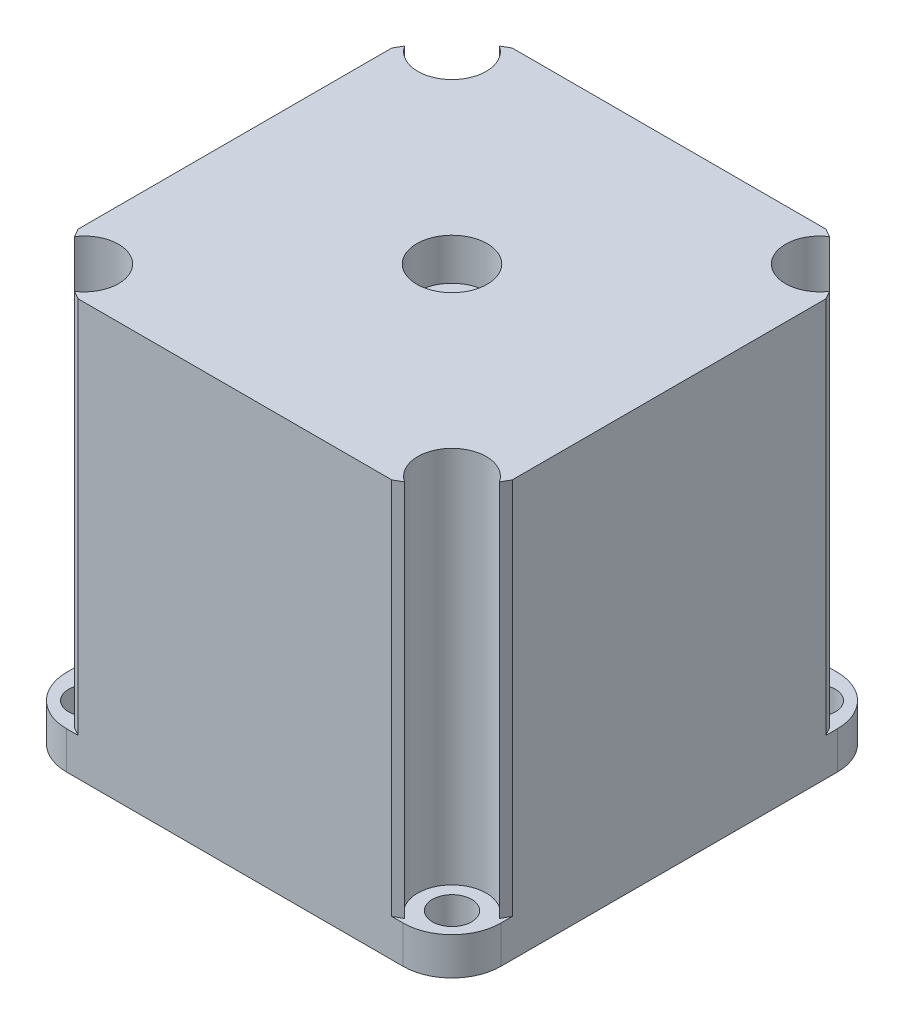
ISO-10303-21;
HEADER;
FILE_DESCRIPTION(('STEP AP214'),'2;1');
FILE_NAME('part.step','',(''),(''),'','','');
FILE_SCHEMA(('AUTOMOTIVE_DESIGN { 1 0 10303 214 1 1 1 1 }'));
ENDSEC;
DATA;
#1=APPLICATION_CONTEXT('core data for automotive mechanical design processes');
#2=APPLICATION_PROTOCOL_DEFINITION('international standard','automotive_design',2000,#1);
#3=PRODUCT_CONTEXT('',#1,'mechanical');
#4=PRODUCT('Part','Part','',(#3));
#5=PRODUCT_RELATED_PRODUCT_CATEGORY('part','',(#4));
#6=PRODUCT_DEFINITION_FORMATION('','',#4);
#7=PRODUCT_DEFINITION_CONTEXT('part definition',#1,'design');
#8=PRODUCT_DEFINITION('design','',#6,#7);
#9=PRODUCT_DEFINITION_SHAPE('','',#8);
#10=(LENGTH_UNIT() NAMED_UNIT(*) SI_UNIT(.MILLI.,.METRE.));
#11=(NAMED_UNIT(*) PLANE_ANGLE_UNIT() SI_UNIT($,.RADIAN.));
#12=(NAMED_UNIT(*) SI_UNIT($,.STERADIAN.) SOLID_ANGLE_UNIT());
#13=UNCERTAINTY_MEASURE_WITH_UNIT(LENGTH_MEASURE(1.E-05),#10,'distance_accuracy_value','');
#14=(GEOMETRIC_REPRESENTATION_CONTEXT(3) GLOBAL_UNCERTAINTY_ASSIGNED_CONTEXT((#13)) GLOBAL_UNIT_ASSIGNED_CONTEXT((#10,
#11,#12)) REPRESENTATION_CONTEXT('',''));
#15=CARTESIAN_POINT('',(0.,0.,0.));
#16=DIRECTION('',(0.,0.,1.));
#17=DIRECTION('',(1.,0.,0.));
#18=AXIS2_PLACEMENT_3D('',#15,#16,#17);
#19=CARTESIAN_POINT('',(0.,-1.8542,0.));
#20=DIRECTION('',(0.,-1.,0.));
#21=DIRECTION('',(0.,0.,-1.));
#22=AXIS2_PLACEMENT_3D('',#19,#20,#21);
#23=PLANE('',#22);
#24=CARTESIAN_POINT('',(0.,-1.8542,0.));
#25=DIRECTION('',(0.,-1.,0.));
#26=DIRECTION('',(0.,0.,-1.));
#27=AXIS2_PLACEMENT_3D('',#24,#25,#26);
#28=CIRCLE('',#27,19.05);
#29=CARTESIAN_POINT('',(0.,-1.8542,-19.05));
#30=VERTEX_POINT('',#29);
#31=EDGE_CURVE('E750',#30,#30,#28,.T.);
#32=ORIENTED_EDGE('',*,*,#31,.T.);
#33=EDGE_LOOP('',(#32));
#34=FACE_BOUND('',#33,.T.);
#35=CARTESIAN_POINT('',(0.,-1.8542,0.));
#36=DIRECTION('',(0.,-1.,0.));
#37=DIRECTION('',(0.,0.,-1.));
#38=AXIS2_PLACEMENT_3D('',#35,#36,#37);
#39=CIRCLE('',#38,3.175);
#40=CARTESIAN_POINT('',(0.,-1.8542,-3.175));
#41=VERTEX_POINT('',#40);
#42=EDGE_CURVE('E747',#41,#41,#39,.T.);
#43=ORIENTED_EDGE('',*,*,#42,.F.);
#44=EDGE_LOOP('',(#43));
#45=FACE_BOUND('',#44,.T.);
#46=ADVANCED_FACE('F50',(#34,#45),#23,.T.);
#47=CARTESIAN_POINT('',(0.,0.,0.));
#48=DIRECTION('',(0.,-1.,0.));
#49=DIRECTION('',(0.,0.,-1.));
#50=AXIS2_PLACEMENT_3D('',#47,#48,#49);
#51=PLANE('',#50);
#52=CARTESIAN_POINT('',(-23.622,0.,-23.622));
#53=DIRECTION('',(0.,-1.,0.));
#54=DIRECTION('',(0.,0.,-1.));
#55=AXIS2_PLACEMENT_3D('',#52,#53,#54);
#56=CIRCLE('',#55,2.54);
#57=CARTESIAN_POINT('',(-23.622,0.,-26.162));
#58=VERTEX_POINT('',#57);
#59=EDGE_CURVE('E760',#58,#58,#56,.F.);
#60=ORIENTED_EDGE('',*,*,#59,.T.);
#61=EDGE_LOOP('',(#60));
#62=FACE_BOUND('',#61,.T.);
#63=CARTESIAN_POINT('',(23.622,0.,-23.622));
#64=DIRECTION('',(0.,-1.,0.));
#65=DIRECTION('',(0.,0.,-1.));
#66=AXIS2_PLACEMENT_3D('',#63,#64,#65);
#67=CIRCLE('',#66,2.54);
#68=CARTESIAN_POINT('',(23.622,0.,-26.162));
#69=VERTEX_POINT('',#68);
#70=EDGE_CURVE('E769',#69,#69,#67,.T.);
#71=ORIENTED_EDGE('',*,*,#70,.F.);
#72=EDGE_LOOP('',(#71));
#73=FACE_BOUND('',#72,.T.);
#74=DIRECTION('',(-1.,0.,0.));
#75=VECTOR('',#74,1.);
#76=CARTESIAN_POINT('',(28.194,0.,-28.194));
#77=LINE('',#76,#75);
#78=CARTESIAN_POINT('',(21.844,0.,-28.194));
#79=VERTEX_POINT('',#78);
#80=CARTESIAN_POINT('',(-21.844,0.,-28.194));
#81=VERTEX_POINT('',#80);
#82=EDGE_CURVE('E218',#79,#81,#77,.T.);
#83=ORIENTED_EDGE('',*,*,#82,.F.);
#84=CARTESIAN_POINT('',(21.844,0.,-21.844));
#85=DIRECTION('',(0.,-1.,0.));
#86=DIRECTION('',(0.,0.,-1.));
#87=AXIS2_PLACEMENT_3D('',#84,#85,#86);
#88=CIRCLE('',#87,6.35);
#89=CARTESIAN_POINT('',(28.194,0.,-21.844));
#90=VERTEX_POINT('',#89);
#91=EDGE_CURVE('E227',#79,#90,#88,.T.);
#92=ORIENTED_EDGE('',*,*,#91,.T.);
#93=DIRECTION('',(0.,0.,-1.));
#94=VECTOR('',#93,1.);
#95=CARTESIAN_POINT('',(28.194,0.,-28.194));
#96=LINE('',#95,#94);
#97=CARTESIAN_POINT('',(28.194,0.,21.844));
#98=VERTEX_POINT('',#97);
#99=EDGE_CURVE('E242',#98,#90,#96,.T.);
#100=ORIENTED_EDGE('',*,*,#99,.F.);
#101=CARTESIAN_POINT('',(21.844,0.,21.844));
#102=DIRECTION('',(0.,-1.,0.));
#103=DIRECTION('',(0.,0.,-1.));
#104=AXIS2_PLACEMENT_3D('',#101,#102,#103);
#105=CIRCLE('',#104,6.35);
#106=CARTESIAN_POINT('',(21.844,0.,28.194));
#107=VERTEX_POINT('',#106);
#108=EDGE_CURVE('E254',#98,#107,#105,.T.);
#109=ORIENTED_EDGE('',*,*,#108,.T.);
#110=DIRECTION('',(1.,0.,0.));
#111=VECTOR('',#110,1.);
#112=CARTESIAN_POINT('',(28.194,0.,28.194));
#113=LINE('',#112,#111);
#114=CARTESIAN_POINT('',(-21.844,0.,28.194));
#115=VERTEX_POINT('',#114);
#116=EDGE_CURVE('E247',#115,#107,#113,.T.);
#117=ORIENTED_EDGE('',*,*,#116,.F.);
#118=CARTESIAN_POINT('',(-21.844,0.,21.844));
#119=DIRECTION('',(0.,-1.,0.));
#120=DIRECTION('',(0.,0.,-1.));
#121=AXIS2_PLACEMENT_3D('',#118,#119,#120);
#122=CIRCLE('',#121,6.35);
#123=CARTESIAN_POINT('',(-28.194,0.,21.844));
#124=VERTEX_POINT('',#123);
#125=EDGE_CURVE('E223',#115,#124,#122,.T.);
#126=ORIENTED_EDGE('',*,*,#125,.T.);
#127=DIRECTION('',(0.,0.,1.));
#128=VECTOR('',#127,1.);
#129=CARTESIAN_POINT('',(-28.194,0.,-28.194));
#130=LINE('',#129,#128);
#131=CARTESIAN_POINT('',(-28.194,0.,-21.844));
#132=VERTEX_POINT('',#131);
#133=EDGE_CURVE('E402',#132,#124,#130,.T.);
#134=ORIENTED_EDGE('',*,*,#133,.F.);
#135=CARTESIAN_POINT('',(-21.844,0.,-21.844));
#136=DIRECTION('',(0.,-1.,0.));
#137=DIRECTION('',(0.,0.,-1.));
#138=AXIS2_PLACEMENT_3D('',#135,#136,#137);
#139=CIRCLE('',#138,6.35);
#140=EDGE_CURVE('E235',#132,#81,#139,.T.);
#141=ORIENTED_EDGE('',*,*,#140,.T.);
#142=EDGE_LOOP('',(#83,#92,#100,#109,#117,#126,#134,#141));
#143=FACE_BOUND('',#142,.T.);
#144=CARTESIAN_POINT('',(-23.622,0.,23.622));
#145=DIRECTION('',(0.,-1.,0.));
#146=DIRECTION('',(0.,0.,-1.));
#147=AXIS2_PLACEMENT_3D('',#144,#145,#146);
#148=CIRCLE('',#147,2.54);
#149=CARTESIAN_POINT('',(-23.622,0.,21.082));
#150=VERTEX_POINT('',#149);
#151=EDGE_CURVE('E382',#150,#150,#148,.T.);
#152=ORIENTED_EDGE('',*,*,#151,.F.);
#153=EDGE_LOOP('',(#152));
#154=FACE_BOUND('',#153,.T.);
#155=CARTESIAN_POINT('',(23.622,0.,23.622));
#156=DIRECTION('',(0.,-1.,0.));
#157=DIRECTION('',(0.,0.,-1.));
#158=AXIS2_PLACEMENT_3D('',#155,#156,#157);
#159=CIRCLE('',#158,2.54);
#160=CARTESIAN_POINT('',(23.622,0.,21.082));
#161=VERTEX_POINT('',#160);
#162=EDGE_CURVE('E772',#161,#161,#159,.F.);
#163=ORIENTED_EDGE('',*,*,#162,.T.);
#164=EDGE_LOOP('',(#163));
#165=FACE_BOUND('',#164,.T.);
#166=CARTESIAN_POINT('',(0.,0.,0.));
#167=DIRECTION('',(0.,-1.,0.));
#168=DIRECTION('',(0.,0.,-1.));
#169=AXIS2_PLACEMENT_3D('',#166,#167,#168);
#170=CIRCLE('',#169,19.05);
#171=CARTESIAN_POINT('',(0.,0.,-19.05));
#172=VERTEX_POINT('',#171);
#173=EDGE_CURVE('E746',#172,#172,#170,.T.);
#174=ORIENTED_EDGE('',*,*,#173,.F.);
#175=EDGE_LOOP('',(#174));
#176=FACE_BOUND('',#175,.T.);
#177=ADVANCED_FACE('F237',(#62,#73,#143,#154,#165,#176),#51,.T.);
#178=CARTESIAN_POINT('',(0.,4.87679999999999,0.));
#179=DIRECTION('',(0.,1.,0.));
#180=DIRECTION('',(0.,0.,1.));
#181=AXIS2_PLACEMENT_3D('',#178,#179,#180);
#182=PLANE('',#181);
#183=CARTESIAN_POINT('',(-21.844,4.87679999999999,-21.844));
#184=DIRECTION('',(0.,1.,0.));
#185=DIRECTION('',(0.,0.,1.));
#186=AXIS2_PLACEMENT_3D('',#183,#184,#185);
#187=CIRCLE('',#186,6.35);
#188=CARTESIAN_POINT('',(-21.844,4.87679999999999,-28.194));
#189=VERTEX_POINT('',#188);
#190=CARTESIAN_POINT('',(-28.194,4.87679999999999,-21.844));
#191=VERTEX_POINT('',#190);
#192=EDGE_CURVE('E266',#189,#191,#187,.T.);
#193=ORIENTED_EDGE('',*,*,#192,.T.);
#194=DIRECTION('',(0.,0.,-1.));
#195=VECTOR('',#194,1.);
#196=CARTESIAN_POINT('',(-28.194,4.87679999999999,0.));
#197=LINE('',#196,#195);
#198=CARTESIAN_POINT('',(-28.194,4.87679999999999,-20.3677680016085));
#199=VERTEX_POINT('',#198);
#200=EDGE_CURVE('E302',#199,#191,#197,.T.);
#201=ORIENTED_EDGE('',*,*,#200,.F.);
#202=DIRECTION('',(-0.495314723269123,0.,0.868713603503958));
#203=VECTOR('',#202,1.);
#204=CARTESIAN_POINT('',(-27.5879462794571,4.87679999999999,-21.430702509218));
#205=LINE('',#204,#203);
#206=CARTESIAN_POINT('',(-27.5879462794571,4.87679999999999,-21.430702509218));
#207=VERTEX_POINT('',#206);
#208=EDGE_CURVE('E356',#199,#207,#205,.F.);
#209=ORIENTED_EDGE('',*,*,#208,.T.);
#210=CARTESIAN_POINT('',(-23.876,4.87679999999999,-23.876));
#211=DIRECTION('',(0.,1.,0.));
#212=DIRECTION('',(0.,0.,1.));
#213=AXIS2_PLACEMENT_3D('',#210,#211,#212);
#214=CIRCLE('',#213,4.445);
#215=CARTESIAN_POINT('',(-21.430702509218,4.87679999999999,-27.5879462794571));
#216=VERTEX_POINT('',#215);
#217=EDGE_CURVE('E404',#207,#216,#214,.T.);
#218=ORIENTED_EDGE('',*,*,#217,.T.);
#219=DIRECTION('',(0.868713603503955,0.,-0.495314723269128));
#220=VECTOR('',#219,1.);
#221=CARTESIAN_POINT('',(-21.430702509218,4.87679999999999,-27.5879462794571));
#222=LINE('',#221,#220);
#223=CARTESIAN_POINT('',(-20.3677680016085,4.87679999999999,-28.194));
#224=VERTEX_POINT('',#223);
#225=EDGE_CURVE('E358',#216,#224,#222,.T.);
#226=ORIENTED_EDGE('',*,*,#225,.T.);
#227=DIRECTION('',(1.,0.,0.));
#228=VECTOR('',#227,1.);
#229=CARTESIAN_POINT('',(0.,4.87679999999999,-28.194));
#230=LINE('',#229,#228);
#231=EDGE_CURVE('E313',#189,#224,#230,.T.);
#232=ORIENTED_EDGE('',*,*,#231,.F.);
#233=EDGE_LOOP('',(#193,#201,#209,#218,#226,#232));
#234=FACE_BOUND('',#233,.T.);
#235=CARTESIAN_POINT('',(-23.622,4.87679999999999,-23.622));
#236=DIRECTION('',(0.,1.,0.));
#237=DIRECTION('',(0.,0.,1.));
#238=AXIS2_PLACEMENT_3D('',#235,#236,#237);
#239=CIRCLE('',#238,2.54);
#240=CARTESIAN_POINT('',(-23.622,4.87679999999999,-21.082));
#241=VERTEX_POINT('',#240);
#242=EDGE_CURVE('E765',#241,#241,#239,.T.);
#243=ORIENTED_EDGE('',*,*,#242,.F.);
#244=EDGE_LOOP('',(#243));
#245=FACE_BOUND('',#244,.T.);
#246=ADVANCED_FACE('F454',(#234,#245),#182,.T.);
#247=CARTESIAN_POINT('',(0.,4.87679999999999,0.));
#248=DIRECTION('',(0.,1.,0.));
#249=DIRECTION('',(0.,0.,1.));
#250=AXIS2_PLACEMENT_3D('',#247,#248,#249);
#251=PLANE('',#250);
#252=CARTESIAN_POINT('',(21.844,4.87679999999999,21.844));
#253=DIRECTION('',(0.,1.,0.));
#254=DIRECTION('',(0.,0.,1.));
#255=AXIS2_PLACEMENT_3D('',#252,#253,#254);
#256=CIRCLE('',#255,6.35);
#257=CARTESIAN_POINT('',(21.844,4.87679999999999,28.194));
#258=VERTEX_POINT('',#257);
#259=CARTESIAN_POINT('',(28.194,4.87679999999999,21.844));
#260=VERTEX_POINT('',#259);
#261=EDGE_CURVE('E73',#258,#260,#256,.T.);
#262=ORIENTED_EDGE('',*,*,#261,.T.);
#263=DIRECTION('',(0.,0.,1.));
#264=VECTOR('',#263,1.);
#265=CARTESIAN_POINT('',(28.194,4.87679999999999,0.));
#266=LINE('',#265,#264);
#267=CARTESIAN_POINT('',(28.194,4.87679999999999,20.3677680016085));
#268=VERTEX_POINT('',#267);
#269=EDGE_CURVE('E322',#268,#260,#266,.T.);
#270=ORIENTED_EDGE('',*,*,#269,.F.);
#271=DIRECTION('',(0.495314723269126,0.,-0.868713603503956));
#272=VECTOR('',#271,1.);
#273=CARTESIAN_POINT('',(27.5879462794571,4.87679999999999,21.430702509218));
#274=LINE('',#273,#272);
#275=CARTESIAN_POINT('',(27.5879462794571,4.87679999999999,21.430702509218));
#276=VERTEX_POINT('',#275);
#277=EDGE_CURVE('E364',#268,#276,#274,.F.);
#278=ORIENTED_EDGE('',*,*,#277,.T.);
#279=CARTESIAN_POINT('',(23.876,4.87679999999999,23.876));
#280=DIRECTION('',(0.,1.,0.));
#281=DIRECTION('',(0.,0.,1.));
#282=AXIS2_PLACEMENT_3D('',#279,#280,#281);
#283=CIRCLE('',#282,4.445);
#284=CARTESIAN_POINT('',(21.430702509218,4.87679999999999,27.5879462794571));
#285=VERTEX_POINT('',#284);
#286=EDGE_CURVE('E430',#276,#285,#283,.T.);
#287=ORIENTED_EDGE('',*,*,#286,.T.);
#288=DIRECTION('',(-0.868713603503955,0.,0.495314723269128));
#289=VECTOR('',#288,1.);
#290=CARTESIAN_POINT('',(21.430702509218,4.87679999999999,27.5879462794571));
#291=LINE('',#290,#289);
#292=CARTESIAN_POINT('',(20.3677680016085,4.87679999999999,28.194));
#293=VERTEX_POINT('',#292);
#294=EDGE_CURVE('E366',#285,#293,#291,.T.);
#295=ORIENTED_EDGE('',*,*,#294,.T.);
#296=DIRECTION('',(-1.,0.,0.));
#297=VECTOR('',#296,1.);
#298=CARTESIAN_POINT('',(0.,4.87679999999999,28.194));
#299=LINE('',#298,#297);
#300=EDGE_CURVE('E347',#258,#293,#299,.T.);
#301=ORIENTED_EDGE('',*,*,#300,.F.);
#302=EDGE_LOOP('',(#262,#270,#278,#287,#295,#301));
#303=FACE_BOUND('',#302,.T.);
#304=CARTESIAN_POINT('',(23.622,4.87679999999999,23.622));
#305=DIRECTION('',(0.,1.,0.));
#306=DIRECTION('',(0.,0.,1.));
#307=AXIS2_PLACEMENT_3D('',#304,#305,#306);
#308=CIRCLE('',#307,2.54);
#309=CARTESIAN_POINT('',(23.622,4.87679999999999,26.162));
#310=VERTEX_POINT('',#309);
#311=EDGE_CURVE('E777',#310,#310,#308,.T.);
#312=ORIENTED_EDGE('',*,*,#311,.F.);
#313=EDGE_LOOP('',(#312));
#314=FACE_BOUND('',#313,.T.);
#315=ADVANCED_FACE('F416',(#303,#314),#251,.T.);
#316=CARTESIAN_POINT('',(0.,53.975,0.));
#317=DIRECTION('',(0.,-1.,0.));
#318=DIRECTION('',(0.,0.,-1.));
#319=AXIS2_PLACEMENT_3D('',#316,#317,#318);
#320=PLANE('',#319);
#321=CARTESIAN_POINT('',(0.,53.975,0.));
#322=DIRECTION('',(0.,1.,0.));
#323=DIRECTION('',(0.,0.,1.));
#324=AXIS2_PLACEMENT_3D('',#321,#322,#323);
#325=CIRCLE('',#324,4.572);
#326=CARTESIAN_POINT('',(0.,53.975,4.572));
#327=VERTEX_POINT('',#326);
#328=EDGE_CURVE('E755',#327,#327,#325,.T.);
#329=ORIENTED_EDGE('',*,*,#328,.F.);
#330=EDGE_LOOP('',(#329));
#331=FACE_BOUND('',#330,.T.);
#332=CARTESIAN_POINT('',(-23.876,53.975,-23.876));
#333=DIRECTION('',(0.,1.,0.));
#334=DIRECTION('',(0.,0.,1.));
#335=AXIS2_PLACEMENT_3D('',#332,#333,#334);
#336=CIRCLE('',#335,4.445);
#337=CARTESIAN_POINT('',(-27.5879462794571,53.975,-21.430702509218));
#338=VERTEX_POINT('',#337);
#339=CARTESIAN_POINT('',(-21.430702509218,53.975,-27.5879462794571));
#340=VERTEX_POINT('',#339);
#341=EDGE_CURVE('E439',#338,#340,#336,.T.);
#342=ORIENTED_EDGE('',*,*,#341,.F.);
#343=DIRECTION('',(0.495314723269123,0.,-0.868713603503958));
#344=VECTOR('',#343,1.);
#345=CARTESIAN_POINT('',(-27.5879462794571,53.975,-21.430702509218));
#346=LINE('',#345,#344);
#347=CARTESIAN_POINT('',(-28.194,53.975,-20.3677680016085));
#348=VERTEX_POINT('',#347);
#349=EDGE_CURVE('E295',#338,#348,#346,.F.);
#350=ORIENTED_EDGE('',*,*,#349,.T.);
#351=DIRECTION('',(0.,0.,1.));
#352=VECTOR('',#351,1.);
#353=CARTESIAN_POINT('',(-28.194,53.975,-28.194));
#354=LINE('',#353,#352);
#355=CARTESIAN_POINT('',(-28.194,53.975,20.3677680016085));
#356=VERTEX_POINT('',#355);
#357=EDGE_CURVE('E241',#348,#356,#354,.T.);
#358=ORIENTED_EDGE('',*,*,#357,.T.);
#359=DIRECTION('',(0.495314723269126,0.,0.868713603503957));
#360=VECTOR('',#359,1.);
#361=CARTESIAN_POINT('',(-27.5879462794571,53.975,21.430702509218));
#362=LINE('',#361,#360);
#363=CARTESIAN_POINT('',(-27.5879462794571,53.975,21.430702509218));
#364=VERTEX_POINT('',#363);
#365=EDGE_CURVE('E281',#356,#364,#362,.T.);
#366=ORIENTED_EDGE('',*,*,#365,.T.);
#367=CARTESIAN_POINT('',(-23.876,53.975,23.876));
#368=DIRECTION('',(0.,-1.,0.));
#369=DIRECTION('',(0.,0.,-1.));
#370=AXIS2_PLACEMENT_3D('',#367,#368,#369);
#371=CIRCLE('',#370,4.445);
#372=CARTESIAN_POINT('',(-21.430702509218,53.975,27.5879462794571));
#373=VERTEX_POINT('',#372);
#374=EDGE_CURVE('E381',#364,#373,#371,.T.);
#375=ORIENTED_EDGE('',*,*,#374,.T.);
#376=DIRECTION('',(-0.868713603503955,0.,-0.495314723269128));
#377=VECTOR('',#376,1.);
#378=CARTESIAN_POINT('',(-21.430702509218,53.975,27.5879462794571));
#379=LINE('',#378,#377);
#380=CARTESIAN_POINT('',(-20.3677680016085,53.975,28.194));
#381=VERTEX_POINT('',#380);
#382=EDGE_CURVE('E283',#373,#381,#379,.F.);
#383=ORIENTED_EDGE('',*,*,#382,.T.);
#384=DIRECTION('',(1.,0.,0.));
#385=VECTOR('',#384,1.);
#386=CARTESIAN_POINT('',(28.194,53.975,28.194));
#387=LINE('',#386,#385);
#388=CARTESIAN_POINT('',(20.3677680016086,53.975,28.194));
#389=VERTEX_POINT('',#388);
#390=EDGE_CURVE('E245',#381,#389,#387,.T.);
#391=ORIENTED_EDGE('',*,*,#390,.T.);
#392=DIRECTION('',(0.868713603503955,0.,-0.495314723269128));
#393=VECTOR('',#392,1.);
#394=CARTESIAN_POINT('',(21.430702509218,53.975,27.5879462794571));
#395=LINE('',#394,#393);
#396=CARTESIAN_POINT('',(21.430702509218,53.975,27.5879462794571));
#397=VERTEX_POINT('',#396);
#398=EDGE_CURVE('E285',#389,#397,#395,.T.);
#399=ORIENTED_EDGE('',*,*,#398,.T.);
#400=CARTESIAN_POINT('',(23.876,53.975,23.876));
#401=DIRECTION('',(0.,1.,0.));
#402=DIRECTION('',(0.,0.,1.));
#403=AXIS2_PLACEMENT_3D('',#400,#401,#402);
#404=CIRCLE('',#403,4.445);
#405=CARTESIAN_POINT('',(27.5879462794571,53.975,21.430702509218));
#406=VERTEX_POINT('',#405);
#407=EDGE_CURVE('E425',#406,#397,#404,.T.);
#408=ORIENTED_EDGE('',*,*,#407,.F.);
#409=DIRECTION('',(-0.495314723269126,0.,0.868713603503956));
#410=VECTOR('',#409,1.);
#411=CARTESIAN_POINT('',(27.5879462794571,53.975,21.430702509218));
#412=LINE('',#411,#410);
#413=CARTESIAN_POINT('',(28.194,53.975,20.3677680016085));
#414=VERTEX_POINT('',#413);
#415=EDGE_CURVE('E287',#406,#414,#412,.F.);
#416=ORIENTED_EDGE('',*,*,#415,.T.);
#417=DIRECTION('',(0.,0.,-1.));
#418=VECTOR('',#417,1.);
#419=CARTESIAN_POINT('',(28.194,53.975,-28.194));
#420=LINE('',#419,#418);
#421=CARTESIAN_POINT('',(28.194,53.975,-20.3677680016085));
#422=VERTEX_POINT('',#421);
#423=EDGE_CURVE('E394',#414,#422,#420,.T.);
#424=ORIENTED_EDGE('',*,*,#423,.T.);
#425=DIRECTION('',(-0.495314723269126,0.,-0.868713603503956));
#426=VECTOR('',#425,1.);
#427=CARTESIAN_POINT('',(27.5879462794571,53.975,-21.430702509218));
#428=LINE('',#427,#426);
#429=CARTESIAN_POINT('',(27.5879462794571,53.975,-21.430702509218));
#430=VERTEX_POINT('',#429);
#431=EDGE_CURVE('E289',#422,#430,#428,.T.);
#432=ORIENTED_EDGE('',*,*,#431,.T.);
#433=CARTESIAN_POINT('',(23.876,53.975,-23.876));
#434=DIRECTION('',(0.,1.,0.));
#435=DIRECTION('',(0.,0.,1.));
#436=AXIS2_PLACEMENT_3D('',#433,#434,#435);
#437=CIRCLE('',#436,4.445);
#438=CARTESIAN_POINT('',(21.430702509218,53.975,-27.5879462794571));
#439=VERTEX_POINT('',#438);
#440=EDGE_CURVE('E433',#430,#439,#437,.F.);
#441=ORIENTED_EDGE('',*,*,#440,.T.);
#442=DIRECTION('',(0.868713603503955,0.,0.495314723269129));
#443=VECTOR('',#442,1.);
#444=CARTESIAN_POINT('',(21.430702509218,53.975,-27.5879462794571));
#445=LINE('',#444,#443);
#446=CARTESIAN_POINT('',(20.3677680016085,53.975,-28.194));
#447=VERTEX_POINT('',#446);
#448=EDGE_CURVE('E291',#439,#447,#445,.F.);
#449=ORIENTED_EDGE('',*,*,#448,.T.);
#450=DIRECTION('',(-1.,0.,0.));
#451=VECTOR('',#450,1.);
#452=CARTESIAN_POINT('',(28.194,53.975,-28.194));
#453=LINE('',#452,#451);
#454=CARTESIAN_POINT('',(-20.3677680016085,53.975,-28.194));
#455=VERTEX_POINT('',#454);
#456=EDGE_CURVE('E251',#447,#455,#453,.T.);
#457=ORIENTED_EDGE('',*,*,#456,.T.);
#458=DIRECTION('',(-0.868713603503955,0.,0.495314723269128));
#459=VECTOR('',#458,1.);
#460=CARTESIAN_POINT('',(-21.430702509218,53.975,-27.5879462794571));
#461=LINE('',#460,#459);
#462=EDGE_CURVE('E293',#455,#340,#461,.T.);
#463=ORIENTED_EDGE('',*,*,#462,.T.);
#464=EDGE_LOOP('',(#342,#350,#358,#366,#375,#383,#391,#399,#408,#416,#424,#432,#441,#449,#457,#463));
#465=FACE_BOUND('',#464,.T.);
#466=ADVANCED_FACE('F389',(#331,#465),#320,.F.);
#467=CARTESIAN_POINT('',(-28.194,53.975,-28.194));
#468=DIRECTION('',(1.,0.,0.));
#469=DIRECTION('',(0.,0.,-1.));
#470=AXIS2_PLACEMENT_3D('',#467,#468,#469);
#471=PLANE('',#470);
#472=ORIENTED_EDGE('',*,*,#357,.F.);
#473=DIRECTION('',(0.,-1.,0.));
#474=VECTOR('',#473,1.);
#475=CARTESIAN_POINT('',(-28.194,53.975,-20.3677680016085));
#476=LINE('',#475,#474);
#477=EDGE_CURVE('E305',#348,#199,#476,.T.);
#478=ORIENTED_EDGE('',*,*,#477,.T.);
#479=ORIENTED_EDGE('',*,*,#200,.T.);
#480=DIRECTION('',(0.,-1.,0.));
#481=VECTOR('',#480,1.);
#482=CARTESIAN_POINT('',(-28.194,53.975,-21.844));
#483=LINE('',#482,#481);
#484=EDGE_CURVE('E264',#191,#132,#483,.T.);
#485=ORIENTED_EDGE('',*,*,#484,.T.);
#486=ORIENTED_EDGE('',*,*,#133,.T.);
#487=DIRECTION('',(0.,-1.,0.));
#488=VECTOR('',#487,1.);
#489=CARTESIAN_POINT('',(-28.194,53.975,21.844));
#490=LINE('',#489,#488);
#491=CARTESIAN_POINT('',(-28.194,4.87679999999999,21.844));
#492=VERTEX_POINT('',#491);
#493=EDGE_CURVE('E261',#124,#492,#490,.F.);
#494=ORIENTED_EDGE('',*,*,#493,.T.);
#495=DIRECTION('',(0.,0.,-1.));
#496=VECTOR('',#495,1.);
#497=CARTESIAN_POINT('',(-28.194,4.87679999999999,0.));
#498=LINE('',#497,#496);
#499=CARTESIAN_POINT('',(-28.194,4.87679999999999,20.3677680016085));
#500=VERTEX_POINT('',#499);
#501=EDGE_CURVE('E299',#492,#500,#498,.T.);
#502=ORIENTED_EDGE('',*,*,#501,.T.);
#503=DIRECTION('',(0.,1.,0.));
#504=VECTOR('',#503,1.);
#505=CARTESIAN_POINT('',(-28.194,53.975,20.3677680016085));
#506=LINE('',#505,#504);
#507=EDGE_CURVE('E297',#500,#356,#506,.T.);
#508=ORIENTED_EDGE('',*,*,#507,.T.);
#509=EDGE_LOOP('',(#472,#478,#479,#485,#486,#494,#502,#508));
#510=FACE_BOUND('',#509,.T.);
#511=ADVANCED_FACE('F462',(#510),#471,.F.);
#512=CARTESIAN_POINT('',(28.194,53.975,28.194));
#513=DIRECTION('',(0.,0.,-1.));
#514=DIRECTION('',(-1.,0.,0.));
#515=AXIS2_PLACEMENT_3D('',#512,#513,#514);
#516=PLANE('',#515);
#517=DIRECTION('',(0.,-1.,0.));
#518=VECTOR('',#517,1.);
#519=CARTESIAN_POINT('',(21.844,53.975,28.194));
#520=LINE('',#519,#518);
#521=EDGE_CURVE('E270',#107,#258,#520,.F.);
#522=ORIENTED_EDGE('',*,*,#521,.T.);
#523=ORIENTED_EDGE('',*,*,#300,.T.);
#524=DIRECTION('',(0.,1.,0.));
#525=VECTOR('',#524,1.);
#526=CARTESIAN_POINT('',(20.3677680016085,53.975,28.194));
#527=LINE('',#526,#525);
#528=EDGE_CURVE('E345',#293,#389,#527,.T.);
#529=ORIENTED_EDGE('',*,*,#528,.T.);
#530=ORIENTED_EDGE('',*,*,#390,.F.);
#531=DIRECTION('',(0.,-1.,0.));
#532=VECTOR('',#531,1.);
#533=CARTESIAN_POINT('',(-20.3677680016085,4.87679999999999,28.194));
#534=LINE('',#533,#532);
#535=CARTESIAN_POINT('',(-20.3677680016085,4.87679999999999,28.194));
#536=VERTEX_POINT('',#535);
#537=EDGE_CURVE('E342',#381,#536,#534,.T.);
#538=ORIENTED_EDGE('',*,*,#537,.T.);
#539=DIRECTION('',(-1.,0.,0.));
#540=VECTOR('',#539,1.);
#541=CARTESIAN_POINT('',(0.,4.87679999999999,28.194));
#542=LINE('',#541,#540);
#543=CARTESIAN_POINT('',(-21.844,4.87679999999999,28.194));
#544=VERTEX_POINT('',#543);
#545=EDGE_CURVE('E339',#536,#544,#542,.T.);
#546=ORIENTED_EDGE('',*,*,#545,.T.);
#547=DIRECTION('',(0.,-1.,0.));
#548=VECTOR('',#547,1.);
#549=CARTESIAN_POINT('',(-21.844,53.975,28.194));
#550=LINE('',#549,#548);
#551=EDGE_CURVE('E268',#544,#115,#550,.T.);
#552=ORIENTED_EDGE('',*,*,#551,.T.);
#553=ORIENTED_EDGE('',*,*,#116,.T.);
#554=EDGE_LOOP('',(#522,#523,#529,#530,#538,#546,#552,#553));
#555=FACE_BOUND('',#554,.T.);
#556=ADVANCED_FACE('F392',(#555),#516,.F.);
#557=CARTESIAN_POINT('',(28.194,53.975,-28.194));
#558=DIRECTION('',(-1.,0.,0.));
#559=DIRECTION('',(0.,0.,1.));
#560=AXIS2_PLACEMENT_3D('',#557,#558,#559);
#561=PLANE('',#560);
#562=DIRECTION('',(0.,-1.,0.));
#563=VECTOR('',#562,1.);
#564=CARTESIAN_POINT('',(28.194,53.975,-21.844));
#565=LINE('',#564,#563);
#566=CARTESIAN_POINT('',(28.194,4.87679999999999,-21.844));
#567=VERTEX_POINT('',#566);
#568=EDGE_CURVE('E230',#90,#567,#565,.F.);
#569=ORIENTED_EDGE('',*,*,#568,.T.);
#570=DIRECTION('',(0.,0.,1.));
#571=VECTOR('',#570,1.);
#572=CARTESIAN_POINT('',(28.194,4.87679999999999,0.));
#573=LINE('',#572,#571);
#574=CARTESIAN_POINT('',(28.194,4.87679999999999,-20.3677680016085));
#575=VERTEX_POINT('',#574);
#576=EDGE_CURVE('E330',#567,#575,#573,.T.);
#577=ORIENTED_EDGE('',*,*,#576,.T.);
#578=DIRECTION('',(0.,1.,0.));
#579=VECTOR('',#578,1.);
#580=CARTESIAN_POINT('',(28.194,53.975,-20.3677680016085));
#581=LINE('',#580,#579);
#582=EDGE_CURVE('E328',#575,#422,#581,.T.);
#583=ORIENTED_EDGE('',*,*,#582,.T.);
#584=ORIENTED_EDGE('',*,*,#423,.F.);
#585=DIRECTION('',(0.,-1.,0.));
#586=VECTOR('',#585,1.);
#587=CARTESIAN_POINT('',(28.194,53.975,20.3677680016085));
#588=LINE('',#587,#586);
#589=EDGE_CURVE('E325',#414,#268,#588,.T.);
#590=ORIENTED_EDGE('',*,*,#589,.T.);
#591=ORIENTED_EDGE('',*,*,#269,.T.);
#592=DIRECTION('',(0.,-1.,0.));
#593=VECTOR('',#592,1.);
#594=CARTESIAN_POINT('',(28.194,53.975,21.844));
#595=LINE('',#594,#593);
#596=EDGE_CURVE('E234',#260,#98,#595,.T.);
#597=ORIENTED_EDGE('',*,*,#596,.T.);
#598=ORIENTED_EDGE('',*,*,#99,.T.);
#599=EDGE_LOOP('',(#569,#577,#583,#584,#590,#591,#597,#598));
#600=FACE_BOUND('',#599,.T.);
#601=ADVANCED_FACE('F411',(#600),#561,.F.);
#602=CARTESIAN_POINT('',(28.194,53.975,-28.194));
#603=DIRECTION('',(0.,0.,1.));
#604=DIRECTION('',(1.,0.,0.));
#605=AXIS2_PLACEMENT_3D('',#602,#603,#604);
#606=PLANE('',#605);
#607=DIRECTION('',(0.,-1.,0.));
#608=VECTOR('',#607,1.);
#609=CARTESIAN_POINT('',(-21.844,53.975,-28.194));
#610=LINE('',#609,#608);
#611=EDGE_CURVE('E224',#81,#189,#610,.F.);
#612=ORIENTED_EDGE('',*,*,#611,.T.);
#613=ORIENTED_EDGE('',*,*,#231,.T.);
#614=DIRECTION('',(0.,1.,0.));
#615=VECTOR('',#614,1.);
#616=CARTESIAN_POINT('',(-20.3677680016085,53.975,-28.194));
#617=LINE('',#616,#615);
#618=EDGE_CURVE('E311',#224,#455,#617,.T.);
#619=ORIENTED_EDGE('',*,*,#618,.T.);
#620=ORIENTED_EDGE('',*,*,#456,.F.);
#621=DIRECTION('',(0.,-1.,0.));
#622=VECTOR('',#621,1.);
#623=CARTESIAN_POINT('',(20.3677680016085,4.87679999999999,-28.194));
#624=LINE('',#623,#622);
#625=CARTESIAN_POINT('',(20.3677680016085,4.87679999999999,-28.194));
#626=VERTEX_POINT('',#625);
#627=EDGE_CURVE('E309',#447,#626,#624,.T.);
#628=ORIENTED_EDGE('',*,*,#627,.T.);
#629=DIRECTION('',(1.,0.,0.));
#630=VECTOR('',#629,1.);
#631=CARTESIAN_POINT('',(0.,4.87679999999999,-28.194));
#632=LINE('',#631,#630);
#633=CARTESIAN_POINT('',(21.844,4.87679999999999,-28.194));
#634=VERTEX_POINT('',#633);
#635=EDGE_CURVE('E221',#626,#634,#632,.T.);
#636=ORIENTED_EDGE('',*,*,#635,.T.);
#637=DIRECTION('',(0.,-1.,0.));
#638=VECTOR('',#637,1.);
#639=CARTESIAN_POINT('',(21.844,53.975,-28.194));
#640=LINE('',#639,#638);
#641=EDGE_CURVE('E213',#634,#79,#640,.T.);
#642=ORIENTED_EDGE('',*,*,#641,.T.);
#643=ORIENTED_EDGE('',*,*,#82,.T.);
#644=EDGE_LOOP('',(#612,#613,#619,#620,#628,#636,#642,#643));
#645=FACE_BOUND('',#644,.T.);
#646=ADVANCED_FACE('F216',(#645),#606,.F.);
#647=CARTESIAN_POINT('',(-23.876,4.87679999999999,-23.876));
#648=DIRECTION('',(0.,1.,0.));
#649=DIRECTION('',(0.,0.,1.));
#650=AXIS2_PLACEMENT_3D('',#647,#648,#649);
#651=CYLINDRICAL_SURFACE('',#650,4.445);
#652=ORIENTED_EDGE('',*,*,#217,.F.);
#653=DIRECTION('',(0.,1.,0.));
#654=VECTOR('',#653,1.);
#655=CARTESIAN_POINT('',(-27.5879462794571,4.87679999999999,-21.430702509218));
#656=LINE('',#655,#654);
#657=EDGE_CURVE('E278',#207,#338,#656,.T.);
#658=ORIENTED_EDGE('',*,*,#657,.T.);
#659=ORIENTED_EDGE('',*,*,#341,.T.);
#660=DIRECTION('',(0.,1.,0.));
#661=VECTOR('',#660,1.);
#662=CARTESIAN_POINT('',(-21.430702509218,4.87679999999999,-27.5879462794571));
#663=LINE('',#662,#661);
#664=EDGE_CURVE('E275',#340,#216,#663,.F.);
#665=ORIENTED_EDGE('',*,*,#664,.T.);
#666=EDGE_LOOP('',(#652,#658,#659,#665));
#667=FACE_BOUND('',#666,.T.);
#668=ADVANCED_FACE('F446',(#667),#651,.F.);
#669=CARTESIAN_POINT('',(23.876,4.87679999999999,-23.876));
#670=DIRECTION('',(0.,1.,0.));
#671=DIRECTION('',(0.,0.,1.));
#672=AXIS2_PLACEMENT_3D('',#669,#670,#671);
#673=CYLINDRICAL_SURFACE('',#672,4.445);
#674=CARTESIAN_POINT('',(23.876,4.87679999999999,-23.876));
#675=DIRECTION('',(0.,1.,0.));
#676=DIRECTION('',(0.,0.,1.));
#677=AXIS2_PLACEMENT_3D('',#674,#675,#676);
#678=CIRCLE('',#677,4.445);
#679=CARTESIAN_POINT('',(27.5879462794571,4.87679999999999,-21.430702509218));
#680=VERTEX_POINT('',#679);
#681=CARTESIAN_POINT('',(21.430702509218,4.87679999999999,-27.5879462794571));
#682=VERTEX_POINT('',#681);
#683=EDGE_CURVE('E429',#680,#682,#678,.F.);
#684=ORIENTED_EDGE('',*,*,#683,.T.);
#685=DIRECTION('',(0.,1.,0.));
#686=VECTOR('',#685,1.);
#687=CARTESIAN_POINT('',(21.430702509218,4.87679999999999,-27.5879462794571));
#688=LINE('',#687,#686);
#689=EDGE_CURVE('E319',#682,#439,#688,.T.);
#690=ORIENTED_EDGE('',*,*,#689,.T.);
#691=ORIENTED_EDGE('',*,*,#440,.F.);
#692=DIRECTION('',(0.,1.,0.));
#693=VECTOR('',#692,1.);
#694=CARTESIAN_POINT('',(27.5879462794571,4.87679999999999,-21.430702509218));
#695=LINE('',#694,#693);
#696=EDGE_CURVE('E316',#430,#680,#695,.F.);
#697=ORIENTED_EDGE('',*,*,#696,.T.);
#698=EDGE_LOOP('',(#684,#690,#691,#697));
#699=FACE_BOUND('',#698,.T.);
#700=ADVANCED_FACE('F531',(#699),#673,.F.);
#701=CARTESIAN_POINT('',(0.,4.87679999999999,0.));
#702=DIRECTION('',(0.,1.,0.));
#703=DIRECTION('',(0.,0.,1.));
#704=AXIS2_PLACEMENT_3D('',#701,#702,#703);
#705=PLANE('',#704);
#706=CARTESIAN_POINT('',(23.622,4.87679999999999,-23.622));
#707=DIRECTION('',(0.,1.,0.));
#708=DIRECTION('',(0.,0.,1.));
#709=AXIS2_PLACEMENT_3D('',#706,#707,#708);
#710=CIRCLE('',#709,2.54);
#711=CARTESIAN_POINT('',(23.622,4.87679999999999,-21.082));
#712=VERTEX_POINT('',#711);
#713=EDGE_CURVE('E768',#712,#712,#710,.F.);
#714=ORIENTED_EDGE('',*,*,#713,.T.);
#715=EDGE_LOOP('',(#714));
#716=FACE_BOUND('',#715,.T.);
#717=ORIENTED_EDGE('',*,*,#683,.F.);
#718=DIRECTION('',(0.495314723269126,0.,0.868713603503956));
#719=VECTOR('',#718,1.);
#720=CARTESIAN_POINT('',(27.5879462794571,4.87679999999999,-21.430702509218));
#721=LINE('',#720,#719);
#722=EDGE_CURVE('E362',#680,#575,#721,.T.);
#723=ORIENTED_EDGE('',*,*,#722,.T.);
#724=ORIENTED_EDGE('',*,*,#576,.F.);
#725=CARTESIAN_POINT('',(21.844,4.87679999999999,-21.844));
#726=DIRECTION('',(0.,1.,0.));
#727=DIRECTION('',(0.,0.,1.));
#728=AXIS2_PLACEMENT_3D('',#725,#726,#727);
#729=CIRCLE('',#728,6.35);
#730=EDGE_CURVE('E259',#567,#634,#729,.T.);
#731=ORIENTED_EDGE('',*,*,#730,.T.);
#732=ORIENTED_EDGE('',*,*,#635,.F.);
#733=DIRECTION('',(-0.868713603503955,0.,-0.495314723269129));
#734=VECTOR('',#733,1.);
#735=CARTESIAN_POINT('',(21.430702509218,4.87679999999999,-27.5879462794571));
#736=LINE('',#735,#734);
#737=EDGE_CURVE('E360',#626,#682,#736,.F.);
#738=ORIENTED_EDGE('',*,*,#737,.T.);
#739=EDGE_LOOP('',(#717,#723,#724,#731,#732,#738));
#740=FACE_BOUND('',#739,.T.);
#741=ADVANCED_FACE('F528',(#716,#740),#705,.T.);
#742=CARTESIAN_POINT('',(23.876,4.87679999999999,23.876));
#743=DIRECTION('',(0.,1.,0.));
#744=DIRECTION('',(0.,0.,1.));
#745=AXIS2_PLACEMENT_3D('',#742,#743,#744);
#746=CYLINDRICAL_SURFACE('',#745,4.445);
#747=ORIENTED_EDGE('',*,*,#286,.F.);
#748=DIRECTION('',(0.,1.,0.));
#749=VECTOR('',#748,1.);
#750=CARTESIAN_POINT('',(27.5879462794571,4.87679999999999,21.430702509218));
#751=LINE('',#750,#749);
#752=EDGE_CURVE('E336',#276,#406,#751,.T.);
#753=ORIENTED_EDGE('',*,*,#752,.T.);
#754=ORIENTED_EDGE('',*,*,#407,.T.);
#755=DIRECTION('',(0.,1.,0.));
#756=VECTOR('',#755,1.);
#757=CARTESIAN_POINT('',(21.430702509218,4.87679999999999,27.5879462794571));
#758=LINE('',#757,#756);
#759=EDGE_CURVE('E333',#397,#285,#758,.F.);
#760=ORIENTED_EDGE('',*,*,#759,.T.);
#761=EDGE_LOOP('',(#747,#753,#754,#760));
#762=FACE_BOUND('',#761,.T.);
#763=ADVANCED_FACE('F427',(#762),#746,.F.);
#764=CARTESIAN_POINT('',(-23.876,4.87679999999999,23.876));
#765=DIRECTION('',(0.,1.,0.));
#766=DIRECTION('',(0.,0.,1.));
#767=AXIS2_PLACEMENT_3D('',#764,#765,#766);
#768=CYLINDRICAL_SURFACE('',#767,4.445);
#769=CARTESIAN_POINT('',(-23.876,4.87679999999999,23.876));
#770=DIRECTION('',(0.,-1.,0.));
#771=DIRECTION('',(0.,0.,-1.));
#772=AXIS2_PLACEMENT_3D('',#769,#770,#771);
#773=CIRCLE('',#772,4.445);
#774=CARTESIAN_POINT('',(-27.5879462794571,4.87679999999999,21.430702509218));
#775=VERTEX_POINT('',#774);
#776=CARTESIAN_POINT('',(-21.430702509218,4.87679999999999,27.5879462794571));
#777=VERTEX_POINT('',#776);
#778=EDGE_CURVE('E372',#775,#777,#773,.T.);
#779=ORIENTED_EDGE('',*,*,#778,.T.);
#780=DIRECTION('',(0.,1.,0.));
#781=VECTOR('',#780,1.);
#782=CARTESIAN_POINT('',(-21.430702509218,4.87679999999999,27.5879462794571));
#783=LINE('',#782,#781);
#784=EDGE_CURVE('E353',#777,#373,#783,.T.);
#785=ORIENTED_EDGE('',*,*,#784,.T.);
#786=ORIENTED_EDGE('',*,*,#374,.F.);
#787=DIRECTION('',(0.,1.,0.));
#788=VECTOR('',#787,1.);
#789=CARTESIAN_POINT('',(-27.5879462794571,4.87679999999999,21.430702509218));
#790=LINE('',#789,#788);
#791=EDGE_CURVE('E350',#364,#775,#790,.F.);
#792=ORIENTED_EDGE('',*,*,#791,.T.);
#793=EDGE_LOOP('',(#779,#785,#786,#792));
#794=FACE_BOUND('',#793,.T.);
#795=ADVANCED_FACE('F377',(#794),#768,.F.);
#796=CARTESIAN_POINT('',(0.,4.87679999999999,0.));
#797=DIRECTION('',(0.,1.,0.));
#798=DIRECTION('',(0.,0.,1.));
#799=AXIS2_PLACEMENT_3D('',#796,#797,#798);
#800=PLANE('',#799);
#801=CARTESIAN_POINT('',(-23.622,4.87679999999999,23.622));
#802=DIRECTION('',(0.,1.,0.));
#803=DIRECTION('',(0.,0.,1.));
#804=AXIS2_PLACEMENT_3D('',#801,#802,#803);
#805=CIRCLE('',#804,2.54);
#806=CARTESIAN_POINT('',(-23.622,4.87679999999999,26.162));
#807=VERTEX_POINT('',#806);
#808=EDGE_CURVE('E780',#807,#807,#805,.F.);
#809=ORIENTED_EDGE('',*,*,#808,.T.);
#810=EDGE_LOOP('',(#809));
#811=FACE_BOUND('',#810,.T.);
#812=ORIENTED_EDGE('',*,*,#778,.F.);
#813=DIRECTION('',(-0.495314723269126,0.,-0.868713603503957));
#814=VECTOR('',#813,1.);
#815=CARTESIAN_POINT('',(-27.5879462794571,4.87679999999999,21.430702509218));
#816=LINE('',#815,#814);
#817=EDGE_CURVE('E12',#775,#500,#816,.T.);
#818=ORIENTED_EDGE('',*,*,#817,.T.);
#819=ORIENTED_EDGE('',*,*,#501,.F.);
#820=CARTESIAN_POINT('',(-21.844,4.87679999999999,21.844));
#821=DIRECTION('',(0.,1.,0.));
#822=DIRECTION('',(0.,0.,1.));
#823=AXIS2_PLACEMENT_3D('',#820,#821,#822);
#824=CIRCLE('',#823,6.35);
#825=EDGE_CURVE('E65',#492,#544,#824,.T.);
#826=ORIENTED_EDGE('',*,*,#825,.T.);
#827=ORIENTED_EDGE('',*,*,#545,.F.);
#828=DIRECTION('',(0.868713603503955,0.,0.495314723269128));
#829=VECTOR('',#828,1.);
#830=CARTESIAN_POINT('',(-21.430702509218,4.87679999999999,27.5879462794571));
#831=LINE('',#830,#829);
#832=EDGE_CURVE('E58',#536,#777,#831,.F.);
#833=ORIENTED_EDGE('',*,*,#832,.T.);
#834=EDGE_LOOP('',(#812,#818,#819,#826,#827,#833));
#835=FACE_BOUND('',#834,.T.);
#836=ADVANCED_FACE('F371',(#811,#835),#800,.T.);
#837=CARTESIAN_POINT('',(21.844,53.975,-21.844));
#838=DIRECTION('',(0.,-1.,0.));
#839=DIRECTION('',(0.,0.,-1.));
#840=AXIS2_PLACEMENT_3D('',#837,#838,#839);
#841=CYLINDRICAL_SURFACE('',#840,6.35);
#842=ORIENTED_EDGE('',*,*,#641,.F.);
#843=ORIENTED_EDGE('',*,*,#730,.F.);
#844=ORIENTED_EDGE('',*,*,#568,.F.);
#845=ORIENTED_EDGE('',*,*,#91,.F.);
#846=EDGE_LOOP('',(#842,#843,#844,#845));
#847=FACE_BOUND('',#846,.T.);
#848=ADVANCED_FACE('F228',(#847),#841,.T.);
#849=CARTESIAN_POINT('',(-21.844,53.975,-21.844));
#850=DIRECTION('',(0.,-1.,0.));
#851=DIRECTION('',(0.,0.,-1.));
#852=AXIS2_PLACEMENT_3D('',#849,#850,#851);
#853=CYLINDRICAL_SURFACE('',#852,6.35);
#854=ORIENTED_EDGE('',*,*,#484,.F.);
#855=ORIENTED_EDGE('',*,*,#192,.F.);
#856=ORIENTED_EDGE('',*,*,#611,.F.);
#857=ORIENTED_EDGE('',*,*,#140,.F.);
#858=EDGE_LOOP('',(#854,#855,#856,#857));
#859=FACE_BOUND('',#858,.T.);
#860=ADVANCED_FACE('F459',(#859),#853,.T.);
#861=CARTESIAN_POINT('',(21.844,53.975,21.844));
#862=DIRECTION('',(0.,-1.,0.));
#863=DIRECTION('',(0.,0.,-1.));
#864=AXIS2_PLACEMENT_3D('',#861,#862,#863);
#865=CYLINDRICAL_SURFACE('',#864,6.35);
#866=ORIENTED_EDGE('',*,*,#596,.F.);
#867=ORIENTED_EDGE('',*,*,#261,.F.);
#868=ORIENTED_EDGE('',*,*,#521,.F.);
#869=ORIENTED_EDGE('',*,*,#108,.F.);
#870=EDGE_LOOP('',(#866,#867,#868,#869));
#871=FACE_BOUND('',#870,.T.);
#872=ADVANCED_FACE('F409',(#871),#865,.T.);
#873=CARTESIAN_POINT('',(-21.844,53.975,21.844));
#874=DIRECTION('',(0.,-1.,0.));
#875=DIRECTION('',(0.,0.,-1.));
#876=AXIS2_PLACEMENT_3D('',#873,#874,#875);
#877=CYLINDRICAL_SURFACE('',#876,6.35);
#878=ORIENTED_EDGE('',*,*,#551,.F.);
#879=ORIENTED_EDGE('',*,*,#825,.F.);
#880=ORIENTED_EDGE('',*,*,#493,.F.);
#881=ORIENTED_EDGE('',*,*,#125,.F.);
#882=EDGE_LOOP('',(#878,#879,#880,#881));
#883=FACE_BOUND('',#882,.T.);
#884=ADVANCED_FACE('F470',(#883),#877,.T.);
#885=CARTESIAN_POINT('',(-27.5879462794571,4.87679999999999,-21.430702509218));
#886=DIRECTION('',(0.868713603503958,0.,0.495314723269123));
#887=DIRECTION('',(0.,1.,0.));
#888=AXIS2_PLACEMENT_3D('',#885,#886,#887);
#889=PLANE('',#888);
#890=ORIENTED_EDGE('',*,*,#208,.F.);
#891=ORIENTED_EDGE('',*,*,#477,.F.);
#892=ORIENTED_EDGE('',*,*,#349,.F.);
#893=ORIENTED_EDGE('',*,*,#657,.F.);
#894=EDGE_LOOP('',(#890,#891,#892,#893));
#895=FACE_BOUND('',#894,.T.);
#896=ADVANCED_FACE('F466',(#895),#889,.F.);
#897=CARTESIAN_POINT('',(-21.430702509218,4.87679999999999,-27.5879462794571));
#898=DIRECTION('',(-0.495314723269128,0.,-0.868713603503955));
#899=DIRECTION('',(0.,1.,0.));
#900=AXIS2_PLACEMENT_3D('',#897,#898,#899);
#901=PLANE('',#900);
#902=ORIENTED_EDGE('',*,*,#462,.F.);
#903=ORIENTED_EDGE('',*,*,#618,.F.);
#904=ORIENTED_EDGE('',*,*,#225,.F.);
#905=ORIENTED_EDGE('',*,*,#664,.F.);
#906=EDGE_LOOP('',(#902,#903,#904,#905));
#907=FACE_BOUND('',#906,.T.);
#908=ADVANCED_FACE('F450',(#907),#901,.T.);
#909=CARTESIAN_POINT('',(21.430702509218,4.87679999999999,-27.5879462794571));
#910=DIRECTION('',(-0.495314723269129,0.,0.868713603503955));
#911=DIRECTION('',(0.,1.,0.));
#912=AXIS2_PLACEMENT_3D('',#909,#910,#911);
#913=PLANE('',#912);
#914=ORIENTED_EDGE('',*,*,#737,.F.);
#915=ORIENTED_EDGE('',*,*,#627,.F.);
#916=ORIENTED_EDGE('',*,*,#448,.F.);
#917=ORIENTED_EDGE('',*,*,#689,.F.);
#918=EDGE_LOOP('',(#914,#915,#916,#917));
#919=FACE_BOUND('',#918,.T.);
#920=ADVANCED_FACE('F583',(#919),#913,.F.);
#921=CARTESIAN_POINT('',(27.5879462794571,4.87679999999999,-21.430702509218));
#922=DIRECTION('',(0.868713603503956,0.,-0.495314723269126));
#923=DIRECTION('',(0.,1.,0.));
#924=AXIS2_PLACEMENT_3D('',#921,#922,#923);
#925=PLANE('',#924);
#926=ORIENTED_EDGE('',*,*,#431,.F.);
#927=ORIENTED_EDGE('',*,*,#582,.F.);
#928=ORIENTED_EDGE('',*,*,#722,.F.);
#929=ORIENTED_EDGE('',*,*,#696,.F.);
#930=EDGE_LOOP('',(#926,#927,#928,#929));
#931=FACE_BOUND('',#930,.T.);
#932=ADVANCED_FACE('F592',(#931),#925,.T.);
#933=CARTESIAN_POINT('',(27.5879462794571,4.87679999999999,21.430702509218));
#934=DIRECTION('',(-0.868713603503956,0.,-0.495314723269126));
#935=DIRECTION('',(0.,1.,0.));
#936=AXIS2_PLACEMENT_3D('',#933,#934,#935);
#937=PLANE('',#936);
#938=ORIENTED_EDGE('',*,*,#277,.F.);
#939=ORIENTED_EDGE('',*,*,#589,.F.);
#940=ORIENTED_EDGE('',*,*,#415,.F.);
#941=ORIENTED_EDGE('',*,*,#752,.F.);
#942=EDGE_LOOP('',(#938,#939,#940,#941));
#943=FACE_BOUND('',#942,.T.);
#944=ADVANCED_FACE('F602',(#943),#937,.F.);
#945=CARTESIAN_POINT('',(21.430702509218,4.87679999999999,27.5879462794571));
#946=DIRECTION('',(0.495314723269128,0.,0.868713603503955));
#947=DIRECTION('',(0.,1.,0.));
#948=AXIS2_PLACEMENT_3D('',#945,#946,#947);
#949=PLANE('',#948);
#950=ORIENTED_EDGE('',*,*,#398,.F.);
#951=ORIENTED_EDGE('',*,*,#528,.F.);
#952=ORIENTED_EDGE('',*,*,#294,.F.);
#953=ORIENTED_EDGE('',*,*,#759,.F.);
#954=EDGE_LOOP('',(#950,#951,#952,#953));
#955=FACE_BOUND('',#954,.T.);
#956=ADVANCED_FACE('F421',(#955),#949,.T.);
#957=CARTESIAN_POINT('',(-21.430702509218,4.87679999999999,27.5879462794571));
#958=DIRECTION('',(0.495314723269128,0.,-0.868713603503955));
#959=DIRECTION('',(0.,1.,0.));
#960=AXIS2_PLACEMENT_3D('',#957,#958,#959);
#961=PLANE('',#960);
#962=ORIENTED_EDGE('',*,*,#832,.F.);
#963=ORIENTED_EDGE('',*,*,#537,.F.);
#964=ORIENTED_EDGE('',*,*,#382,.F.);
#965=ORIENTED_EDGE('',*,*,#784,.F.);
#966=EDGE_LOOP('',(#962,#963,#964,#965));
#967=FACE_BOUND('',#966,.T.);
#968=ADVANCED_FACE('F384',(#967),#961,.F.);
#969=CARTESIAN_POINT('',(-27.5879462794571,4.87679999999999,21.430702509218));
#970=DIRECTION('',(-0.868713603503957,0.,0.495314723269126));
#971=DIRECTION('',(0.,1.,0.));
#972=AXIS2_PLACEMENT_3D('',#969,#970,#971);
#973=PLANE('',#972);
#974=ORIENTED_EDGE('',*,*,#365,.F.);
#975=ORIENTED_EDGE('',*,*,#507,.F.);
#976=ORIENTED_EDGE('',*,*,#817,.F.);
#977=ORIENTED_EDGE('',*,*,#791,.F.);
#978=EDGE_LOOP('',(#974,#975,#976,#977));
#979=FACE_BOUND('',#978,.T.);
#980=ADVANCED_FACE('F52',(#979),#973,.T.);
#981=CARTESIAN_POINT('',(-23.622,53.976,23.622));
#982=DIRECTION('',(0.,-1.,0.));
#983=DIRECTION('',(0.,0.,-1.));
#984=AXIS2_PLACEMENT_3D('',#981,#982,#983);
#985=CYLINDRICAL_SURFACE('',#984,2.54);
#986=ORIENTED_EDGE('',*,*,#808,.F.);
#987=EDGE_LOOP('',(#986));
#988=FACE_BOUND('',#987,.T.);
#989=ORIENTED_EDGE('',*,*,#151,.T.);
#990=EDGE_LOOP('',(#989));
#991=FACE_BOUND('',#990,.T.);
#992=ADVANCED_FACE('F516',(#988,#991),#985,.F.);
#993=CARTESIAN_POINT('',(23.622,53.976,23.622));
#994=DIRECTION('',(0.,-1.,0.));
#995=DIRECTION('',(0.,0.,-1.));
#996=AXIS2_PLACEMENT_3D('',#993,#994,#995);
#997=CYLINDRICAL_SURFACE('',#996,2.54);
#998=ORIENTED_EDGE('',*,*,#311,.T.);
#999=EDGE_LOOP('',(#998));
#1000=FACE_BOUND('',#999,.T.);
#1001=ORIENTED_EDGE('',*,*,#162,.F.);
#1002=EDGE_LOOP('',(#1001));
#1003=FACE_BOUND('',#1002,.T.);
#1004=ADVANCED_FACE('F512',(#1000,#1003),#997,.F.);
#1005=CARTESIAN_POINT('',(23.622,53.976,-23.622));
#1006=DIRECTION('',(0.,-1.,0.));
#1007=DIRECTION('',(0.,0.,-1.));
#1008=AXIS2_PLACEMENT_3D('',#1005,#1006,#1007);
#1009=CYLINDRICAL_SURFACE('',#1008,2.54);
#1010=ORIENTED_EDGE('',*,*,#713,.F.);
#1011=EDGE_LOOP('',(#1010));
#1012=FACE_BOUND('',#1011,.T.);
#1013=ORIENTED_EDGE('',*,*,#70,.T.);
#1014=EDGE_LOOP('',(#1013));
#1015=FACE_BOUND('',#1014,.T.);
#1016=ADVANCED_FACE('F508',(#1012,#1015),#1009,.F.);
#1017=CARTESIAN_POINT('',(-23.622,53.976,-23.622));
#1018=DIRECTION('',(0.,-1.,0.));
#1019=DIRECTION('',(0.,0.,-1.));
#1020=AXIS2_PLACEMENT_3D('',#1017,#1018,#1019);
#1021=CYLINDRICAL_SURFACE('',#1020,2.54);
#1022=ORIENTED_EDGE('',*,*,#242,.T.);
#1023=EDGE_LOOP('',(#1022));
#1024=FACE_BOUND('',#1023,.T.);
#1025=ORIENTED_EDGE('',*,*,#59,.F.);
#1026=EDGE_LOOP('',(#1025));
#1027=FACE_BOUND('',#1026,.T.);
#1028=ADVANCED_FACE('F504',(#1024,#1027),#1021,.F.);
#1029=CARTESIAN_POINT('',(0.,48.5648,0.));
#1030=DIRECTION('',(0.,1.,0.));
#1031=DIRECTION('',(0.,0.,1.));
#1032=AXIS2_PLACEMENT_3D('',#1029,#1030,#1031);
#1033=CYLINDRICAL_SURFACE('',#1032,4.572);
#1034=CARTESIAN_POINT('',(0.,48.5648,0.));
#1035=DIRECTION('',(0.,1.,0.));
#1036=DIRECTION('',(0.,0.,1.));
#1037=AXIS2_PLACEMENT_3D('',#1034,#1035,#1036);
#1038=CIRCLE('',#1037,4.572);
#1039=CARTESIAN_POINT('',(0.,48.5648,4.572));
#1040=VERTEX_POINT('',#1039);
#1041=EDGE_CURVE('E757',#1040,#1040,#1038,.T.);
#1042=ORIENTED_EDGE('',*,*,#1041,.F.);
#1043=EDGE_LOOP('',(#1042));
#1044=FACE_BOUND('',#1043,.T.);
#1045=ORIENTED_EDGE('',*,*,#328,.T.);
#1046=EDGE_LOOP('',(#1045));
#1047=FACE_BOUND('',#1046,.T.);
#1048=ADVANCED_FACE('F500',(#1044,#1047),#1033,.F.);
#1049=CARTESIAN_POINT('',(0.,48.5648,0.));
#1050=DIRECTION('',(0.,1.,0.));
#1051=DIRECTION('',(0.,0.,1.));
#1052=AXIS2_PLACEMENT_3D('',#1049,#1050,#1051);
#1053=PLANE('',#1052);
#1054=ORIENTED_EDGE('',*,*,#1041,.T.);
#1055=EDGE_LOOP('',(#1054));
#1056=FACE_BOUND('',#1055,.T.);
#1057=ADVANCED_FACE('F496',(#1056),#1053,.T.);
#1058=CARTESIAN_POINT('',(0.,-1.8542,0.));
#1059=DIRECTION('',(0.,1.,0.));
#1060=DIRECTION('',(0.,0.,1.));
#1061=AXIS2_PLACEMENT_3D('',#1058,#1059,#1060);
#1062=CYLINDRICAL_SURFACE('',#1061,19.05);
#1063=ORIENTED_EDGE('',*,*,#31,.F.);
#1064=EDGE_LOOP('',(#1063));
#1065=FACE_BOUND('',#1064,.T.);
#1066=ORIENTED_EDGE('',*,*,#173,.T.);
#1067=EDGE_LOOP('',(#1066));
#1068=FACE_BOUND('',#1067,.T.);
#1069=ADVANCED_FACE('F493',(#1065,#1068),#1062,.T.);
#1070=CARTESIAN_POINT('',(0.,-20.4978,0.));
#1071=DIRECTION('',(0.,1.,0.));
#1072=DIRECTION('',(0.,0.,1.));
#1073=AXIS2_PLACEMENT_3D('',#1070,#1071,#1072);
#1074=CYLINDRICAL_SURFACE('',#1073,3.175);
#1075=CARTESIAN_POINT('',(0.,-20.4978,0.));
#1076=DIRECTION('',(0.,-1.,0.));
#1077=DIRECTION('',(0.,0.,-1.));
#1078=AXIS2_PLACEMENT_3D('',#1075,#1076,#1077);
#1079=CIRCLE('',#1078,3.175);
#1080=CARTESIAN_POINT('',(0.,-20.4978,-3.175));
#1081=VERTEX_POINT('',#1080);
#1082=EDGE_CURVE('E745',#1081,#1081,#1079,.T.);
#1083=ORIENTED_EDGE('',*,*,#1082,.F.);
#1084=EDGE_LOOP('',(#1083));
#1085=FACE_BOUND('',#1084,.T.);
#1086=ORIENTED_EDGE('',*,*,#42,.T.);
#1087=EDGE_LOOP('',(#1086));
#1088=FACE_BOUND('',#1087,.T.);
#1089=ADVANCED_FACE('F491',(#1085,#1088),#1074,.T.);
#1090=CARTESIAN_POINT('',(0.,-20.4978,0.));
#1091=DIRECTION('',(0.,-1.,0.));
#1092=DIRECTION('',(0.,0.,-1.));
#1093=AXIS2_PLACEMENT_3D('',#1090,#1091,#1092);
#1094=PLANE('',#1093);
#1095=ORIENTED_EDGE('',*,*,#1082,.T.);
#1096=EDGE_LOOP('',(#1095));
#1097=FACE_BOUND('',#1096,.T.);
#1098=ADVANCED_FACE('F731',(#1097),#1094,.T.);
#1099=CLOSED_SHELL('',(#46,#177,#246,#315,#466,#511,#556,#601,#646,#668,#700,#741,#763,#795,
#836,#848,#860,#872,#884,#896,#908,#920,#932,#944,#956,#968,#980,#992,#1004,#1016,#1028,#1048,
#1057,#1069,#1089,#1098));
#1100=MANIFOLD_SOLID_BREP('B2',#1099);
#1101=ADVANCED_BREP_SHAPE_REPRESENTATION('',(#18,#1100),#14);
#1102=SHAPE_DEFINITION_REPRESENTATION(#9,#1101);
ENDSEC;
END-ISO-10303-21;
